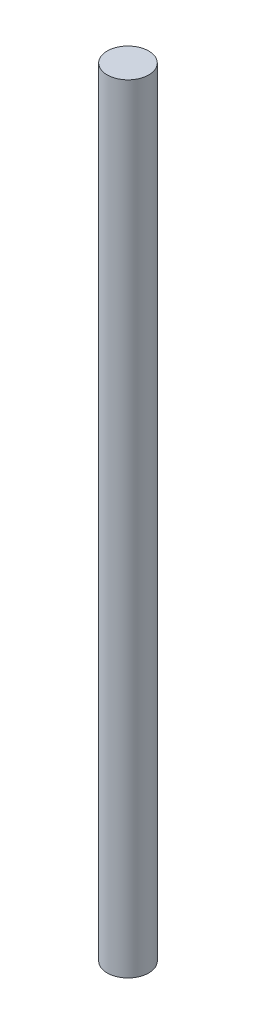
ISO-10303-21;
HEADER;
FILE_DESCRIPTION(('STEP AP214'),'2;1');
FILE_NAME('part.step','',(''),(''),'','','');
FILE_SCHEMA(('AUTOMOTIVE_DESIGN { 1 0 10303 214 1 1 1 1 }'));
ENDSEC;
DATA;
#1=APPLICATION_CONTEXT('core data for automotive mechanical design processes');
#2=APPLICATION_PROTOCOL_DEFINITION('international standard','automotive_design',2000,#1);
#3=PRODUCT_CONTEXT('',#1,'mechanical');
#4=PRODUCT('Part','Part','',(#3));
#5=PRODUCT_RELATED_PRODUCT_CATEGORY('part','',(#4));
#6=PRODUCT_DEFINITION_FORMATION('','',#4);
#7=PRODUCT_DEFINITION_CONTEXT('part definition',#1,'design');
#8=PRODUCT_DEFINITION('design','',#6,#7);
#9=PRODUCT_DEFINITION_SHAPE('','',#8);
#10=(LENGTH_UNIT() NAMED_UNIT(*) SI_UNIT(.MILLI.,.METRE.));
#11=(NAMED_UNIT(*) PLANE_ANGLE_UNIT() SI_UNIT($,.RADIAN.));
#12=(NAMED_UNIT(*) SI_UNIT($,.STERADIAN.) SOLID_ANGLE_UNIT());
#13=UNCERTAINTY_MEASURE_WITH_UNIT(LENGTH_MEASURE(1.E-05),#10,'distance_accuracy_value','');
#14=(GEOMETRIC_REPRESENTATION_CONTEXT(3) GLOBAL_UNCERTAINTY_ASSIGNED_CONTEXT((#13)) GLOBAL_UNIT_ASSIGNED_CONTEXT((#10,
#11,#12)) REPRESENTATION_CONTEXT('',''));
#15=CARTESIAN_POINT('',(0.,0.,0.));
#16=DIRECTION('',(0.,0.,1.));
#17=DIRECTION('',(1.,0.,0.));
#18=AXIS2_PLACEMENT_3D('',#15,#16,#17);
#19=CARTESIAN_POINT('',(0.,75.,0.));
#20=DIRECTION('',(0.,-1.,0.));
#21=DIRECTION('',(0.,0.,-1.));
#22=AXIS2_PLACEMENT_3D('',#19,#20,#21);
#23=CYLINDRICAL_SURFACE('',#22,4.);
#24=CARTESIAN_POINT('',(0.,75.,0.));
#25=DIRECTION('',(0.,1.,0.));
#26=DIRECTION('',(0.,0.,1.));
#27=AXIS2_PLACEMENT_3D('',#24,#25,#26);
#28=CIRCLE('',#27,4.);
#29=CARTESIAN_POINT('',(0.,75.,4.));
#30=VERTEX_POINT('',#29);
#31=EDGE_CURVE('E10',#30,#30,#28,.T.);
#32=ORIENTED_EDGE('',*,*,#31,.F.);
#33=EDGE_LOOP('',(#32));
#34=FACE_BOUND('',#33,.T.);
#35=CARTESIAN_POINT('',(0.,-75.,0.));
#36=DIRECTION('',(0.,1.,0.));
#37=DIRECTION('',(0.,0.,1.));
#38=AXIS2_PLACEMENT_3D('',#35,#36,#37);
#39=CIRCLE('',#38,4.);
#40=CARTESIAN_POINT('',(0.,-75.,4.));
#41=VERTEX_POINT('',#40);
#42=EDGE_CURVE('E36',#41,#41,#39,.T.);
#43=ORIENTED_EDGE('',*,*,#42,.T.);
#44=EDGE_LOOP('',(#43));
#45=FACE_BOUND('',#44,.T.);
#46=ADVANCED_FACE('F33',(#34,#45),#23,.T.);
#47=CARTESIAN_POINT('',(0.,75.,0.));
#48=DIRECTION('',(0.,1.,0.));
#49=DIRECTION('',(0.,0.,1.));
#50=AXIS2_PLACEMENT_3D('',#47,#48,#49);
#51=PLANE('',#50);
#52=ORIENTED_EDGE('',*,*,#31,.T.);
#53=EDGE_LOOP('',(#52));
#54=FACE_BOUND('',#53,.T.);
#55=ADVANCED_FACE('F48',(#54),#51,.T.);
#56=CARTESIAN_POINT('',(0.,-75.,0.));
#57=DIRECTION('',(0.,1.,0.));
#58=DIRECTION('',(0.,0.,1.));
#59=AXIS2_PLACEMENT_3D('',#56,#57,#58);
#60=PLANE('',#59);
#61=ORIENTED_EDGE('',*,*,#42,.F.);
#62=EDGE_LOOP('',(#61));
#63=FACE_BOUND('',#62,.T.);
#64=ADVANCED_FACE('F46',(#63),#60,.F.);
#65=CLOSED_SHELL('',(#46,#55,#64));
#66=MANIFOLD_SOLID_BREP('B2',#65);
#67=ADVANCED_BREP_SHAPE_REPRESENTATION('',(#18,#66),#14);
#68=SHAPE_DEFINITION_REPRESENTATION(#9,#67);
ENDSEC;
END-ISO-10303-21;
